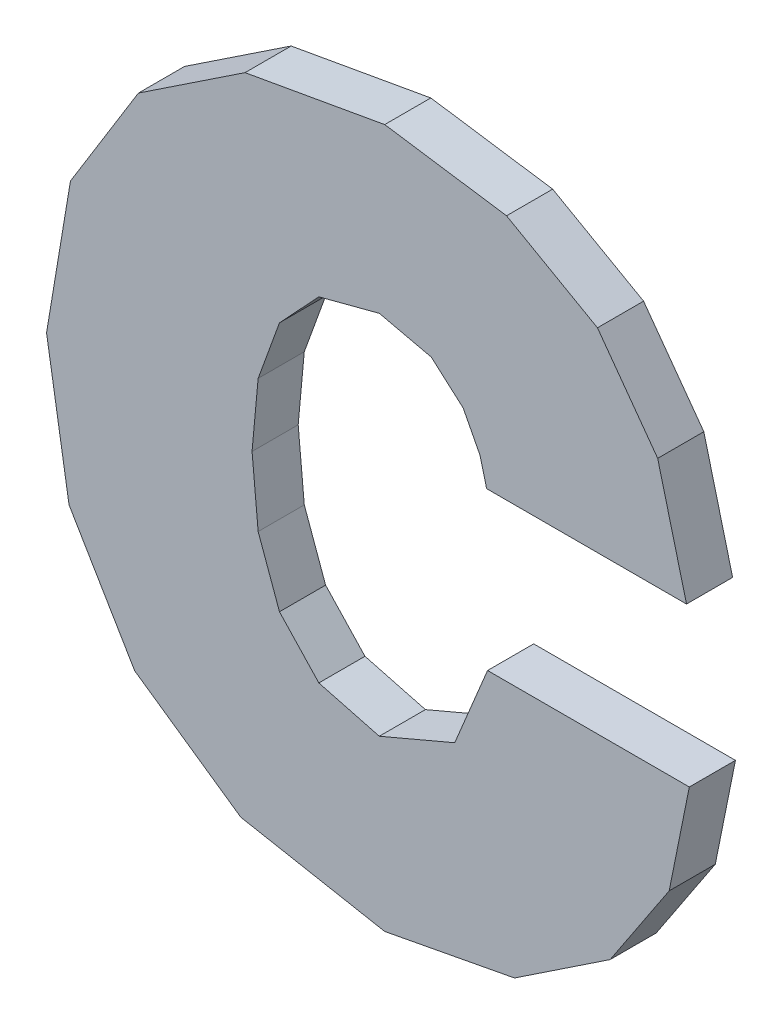
ISO-10303-21;
HEADER;
FILE_DESCRIPTION(('STEP AP214'),'2;1');
FILE_NAME('part.step','',(''),(''),'','','');
FILE_SCHEMA(('AUTOMOTIVE_DESIGN { 1 0 10303 214 1 1 1 1 }'));
ENDSEC;
DATA;
#1=APPLICATION_CONTEXT('core data for automotive mechanical design processes');
#2=APPLICATION_PROTOCOL_DEFINITION('international standard','automotive_design',2000,#1);
#3=PRODUCT_CONTEXT('',#1,'mechanical');
#4=PRODUCT('Part','Part','',(#3));
#5=PRODUCT_RELATED_PRODUCT_CATEGORY('part','',(#4));
#6=PRODUCT_DEFINITION_FORMATION('','',#4);
#7=PRODUCT_DEFINITION_CONTEXT('part definition',#1,'design');
#8=PRODUCT_DEFINITION('design','',#6,#7);
#9=PRODUCT_DEFINITION_SHAPE('','',#8);
#10=(LENGTH_UNIT() NAMED_UNIT(*) SI_UNIT(.MILLI.,.METRE.));
#11=(NAMED_UNIT(*) PLANE_ANGLE_UNIT() SI_UNIT($,.RADIAN.));
#12=(NAMED_UNIT(*) SI_UNIT($,.STERADIAN.) SOLID_ANGLE_UNIT());
#13=UNCERTAINTY_MEASURE_WITH_UNIT(LENGTH_MEASURE(1.E-05),#10,'distance_accuracy_value','');
#14=(GEOMETRIC_REPRESENTATION_CONTEXT(3) GLOBAL_UNCERTAINTY_ASSIGNED_CONTEXT((#13)) GLOBAL_UNIT_ASSIGNED_CONTEXT((#10,
#11,#12)) REPRESENTATION_CONTEXT('',''));
#15=CARTESIAN_POINT('',(0.,0.,0.));
#16=DIRECTION('',(0.,0.,1.));
#17=DIRECTION('',(1.,0.,0.));
#18=AXIS2_PLACEMENT_3D('',#15,#16,#17);
#19=CARTESIAN_POINT('',(0.,0.,0.05));
#20=DIRECTION('',(0.,0.,1.));
#21=DIRECTION('',(1.,0.,0.));
#22=AXIS2_PLACEMENT_3D('',#19,#20,#21);
#23=PLANE('',#22);
#24=DIRECTION('',(-0.869893934693317,0.49323882894981,0.));
#25=VECTOR('',#24,1.);
#26=CARTESIAN_POINT('',(1.340866,1.319276,0.05));
#27=LINE('',#26,#25);
#28=CARTESIAN_POINT('',(1.242314,1.375156,0.05));
#29=VERTEX_POINT('',#28);
#30=CARTESIAN_POINT('',(1.340866,1.319276,0.05));
#31=VERTEX_POINT('',#30);
#32=EDGE_CURVE('E238',#29,#31,#27,.F.);
#33=ORIENTED_EDGE('',*,*,#32,.F.);
#34=DIRECTION('',(-0.989213673825086,0.146479717085598,0.));
#35=VECTOR('',#34,1.);
#36=CARTESIAN_POINT('',(1.242314,1.375156,0.05));
#37=LINE('',#36,#35);
#38=CARTESIAN_POINT('',(1.110234,1.394714,0.05));
#39=VERTEX_POINT('',#38);
#40=EDGE_CURVE('E20',#39,#29,#37,.F.);
#41=ORIENTED_EDGE('',*,*,#40,.F.);
#42=DIRECTION('',(-0.984549852811266,-0.175104504023494,0.));
#43=VECTOR('',#42,1.);
#44=CARTESIAN_POINT('',(1.110234,1.394714,0.05));
#45=LINE('',#44,#43);
#46=CARTESIAN_POINT('',(0.95885,1.36779,0.05));
#47=VERTEX_POINT('',#46);
#48=EDGE_CURVE('E227',#47,#39,#45,.F.);
#49=ORIENTED_EDGE('',*,*,#48,.F.);
#50=DIRECTION('',(-0.832331618057671,-0.554277978618581,0.));
#51=VECTOR('',#50,1.);
#52=CARTESIAN_POINT('',(0.95885,1.36779,0.05));
#53=LINE('',#52,#51);
#54=CARTESIAN_POINT('',(0.843279999999999,1.290828,0.05));
#55=VERTEX_POINT('',#54);
#56=EDGE_CURVE('E222',#55,#47,#53,.F.);
#57=ORIENTED_EDGE('',*,*,#56,.F.);
#58=DIRECTION('',(-0.525107327046591,-0.851036012799685,0.));
#59=VECTOR('',#58,1.);
#60=CARTESIAN_POINT('',(0.84328,1.290828,0.05));
#61=LINE('',#60,#59);
#62=CARTESIAN_POINT('',(0.769620000000001,1.171448,0.05));
#63=VERTEX_POINT('',#62);
#64=EDGE_CURVE('E249',#63,#55,#61,.F.);
#65=ORIENTED_EDGE('',*,*,#64,.F.);
#66=DIRECTION('',(-0.164398987305406,-0.986393923832136,0.));
#67=VECTOR('',#66,1.);
#68=CARTESIAN_POINT('',(0.76962,1.171448,0.05));
#69=LINE('',#68,#67);
#70=CARTESIAN_POINT('',(0.743711999999998,1.016,0.05));
#71=VERTEX_POINT('',#70);
#72=EDGE_CURVE('E253',#71,#63,#69,.F.);
#73=ORIENTED_EDGE('',*,*,#72,.F.);
#74=DIRECTION('',(0.161131898902196,-0.986932880775675,0.));
#75=VECTOR('',#74,1.);
#76=CARTESIAN_POINT('',(0.743712,1.016,0.05));
#77=LINE('',#76,#75);
#78=CARTESIAN_POINT('',(0.768096000000002,0.866648,0.05));
#79=VERTEX_POINT('',#78);
#80=EDGE_CURVE('E257',#79,#71,#77,.F.);
#81=ORIENTED_EDGE('',*,*,#80,.F.);
#82=DIRECTION('',(0.509403382870611,-0.860527857492119,0.));
#83=VECTOR('',#82,1.);
#84=CARTESIAN_POINT('',(0.768096,0.866648,0.05));
#85=LINE('',#84,#83);
#86=CARTESIAN_POINT('',(0.839216,0.746506,0.05));
#87=VERTEX_POINT('',#86);
#88=EDGE_CURVE('E261',#87,#79,#85,.F.);
#89=ORIENTED_EDGE('',*,*,#88,.F.);
#90=DIRECTION('',(0.821016008077818,-0.570905171179912,0.));
#91=VECTOR('',#90,1.);
#92=CARTESIAN_POINT('',(0.839216,0.746506,0.05));
#93=LINE('',#92,#91);
#94=CARTESIAN_POINT('',(0.954278000000001,0.666496000000001,0.05));
#95=VERTEX_POINT('',#94);
#96=EDGE_CURVE('E265',#95,#87,#93,.F.);
#97=ORIENTED_EDGE('',*,*,#96,.F.);
#98=DIRECTION('',(0.982908413087869,-0.184095223949694,0.));
#99=VECTOR('',#98,1.);
#100=CARTESIAN_POINT('',(0.954278,0.666496,0.05));
#101=LINE('',#100,#99);
#102=CARTESIAN_POINT('',(1.110234,0.637286,0.05));
#103=VERTEX_POINT('',#102);
#104=EDGE_CURVE('E269',#103,#95,#101,.F.);
#105=ORIENTED_EDGE('',*,*,#104,.F.);
#106=DIRECTION('',(0.982508908375038,0.186215587327407,0.));
#107=VECTOR('',#106,1.);
#108=CARTESIAN_POINT('',(1.110234,0.637286,0.05));
#109=LINE('',#108,#107);
#110=CARTESIAN_POINT('',(1.25095,0.663956,0.05));
#111=VERTEX_POINT('',#110);
#112=EDGE_CURVE('E273',#111,#103,#109,.F.);
#113=ORIENTED_EDGE('',*,*,#112,.F.);
#114=DIRECTION('',(0.832050294337844,0.554700196225229,0.));
#115=VECTOR('',#114,1.);
#116=CARTESIAN_POINT('',(1.25095,0.663956,0.05));
#117=LINE('',#116,#115);
#118=CARTESIAN_POINT('',(1.354582,0.733044,0.05));
#119=VERTEX_POINT('',#118);
#120=EDGE_CURVE('E277',#119,#111,#117,.F.);
#121=ORIENTED_EDGE('',*,*,#120,.F.);
#122=DIRECTION('',(0.552674107061597,0.833397463029296,0.));
#123=VECTOR('',#122,1.);
#124=CARTESIAN_POINT('',(1.354582,0.733044,0.05));
#125=LINE('',#124,#123);
#126=CARTESIAN_POINT('',(1.41859,0.829563999999999,0.05));
#127=VERTEX_POINT('',#126);
#128=EDGE_CURVE('E281',#127,#119,#125,.F.);
#129=ORIENTED_EDGE('',*,*,#128,.F.);
#130=DIRECTION('',(0.197440467416607,0.980314878917132,0.));
#131=VECTOR('',#130,1.);
#132=CARTESIAN_POINT('',(1.41859,0.829564,0.05));
#133=LINE('',#132,#131);
#134=CARTESIAN_POINT('',(1.440434,0.938022,0.05));
#135=VERTEX_POINT('',#134);
#136=EDGE_CURVE('E285',#135,#127,#133,.F.);
#137=ORIENTED_EDGE('',*,*,#136,.F.);
#138=DIRECTION('',(1.,0.,0.));
#139=VECTOR('',#138,1.);
#140=CARTESIAN_POINT('',(1.440434,0.938022,0.05));
#141=LINE('',#140,#139);
#142=CARTESIAN_POINT('',(1.22174,0.938022,0.05));
#143=VERTEX_POINT('',#142);
#144=EDGE_CURVE('E289',#143,#135,#141,.T.);
#145=ORIENTED_EDGE('',*,*,#144,.F.);
#146=DIRECTION('',(-0.383642282701998,-0.923481780504196,0.));
#147=VECTOR('',#146,1.);
#148=CARTESIAN_POINT('',(1.22174,0.938022,0.05));
#149=LINE('',#148,#147);
#150=CARTESIAN_POINT('',(1.18618,0.852424,0.05));
#151=VERTEX_POINT('',#150);
#152=EDGE_CURVE('E293',#151,#143,#149,.F.);
#153=ORIENTED_EDGE('',*,*,#152,.F.);
#154=DIRECTION('',(-0.920176540598012,-0.391503683422105,0.));
#155=VECTOR('',#154,1.);
#156=CARTESIAN_POINT('',(1.18618,0.852424,0.05));
#157=LINE('',#156,#155);
#158=CARTESIAN_POINT('',(1.104392,0.817626000000001,0.05));
#159=VERTEX_POINT('',#158);
#160=EDGE_CURVE('E297',#159,#151,#157,.F.);
#161=ORIENTED_EDGE('',*,*,#160,.F.);
#162=DIRECTION('',(-0.96697736909533,0.254862252319708,0.));
#163=VECTOR('',#162,1.);
#164=CARTESIAN_POINT('',(1.104392,0.817626,0.05));
#165=LINE('',#164,#163);
#166=CARTESIAN_POINT('',(1.03886,0.834898,0.05));
#167=VERTEX_POINT('',#166);
#168=EDGE_CURVE('E301',#167,#159,#165,.F.);
#169=ORIENTED_EDGE('',*,*,#168,.F.);
#170=DIRECTION('',(-0.6843475255433,0.7291559944777,0.));
#171=VECTOR('',#170,1.);
#172=CARTESIAN_POINT('',(1.03886,0.834898,0.05));
#173=LINE('',#172,#171);
#174=CARTESIAN_POINT('',(0.996188,0.880364,0.05));
#175=VERTEX_POINT('',#174);
#176=EDGE_CURVE('E305',#175,#167,#173,.F.);
#177=ORIENTED_EDGE('',*,*,#176,.F.);
#178=DIRECTION('',(-0.340840704340804,0.940121063621311,0.));
#179=VECTOR('',#178,1.);
#180=CARTESIAN_POINT('',(0.996188,0.880364,0.05));
#181=LINE('',#180,#179);
#182=CARTESIAN_POINT('',(0.973074,0.944118,0.05));
#183=VERTEX_POINT('',#182);
#184=EDGE_CURVE('E309',#183,#175,#181,.F.);
#185=ORIENTED_EDGE('',*,*,#184,.F.);
#186=DIRECTION('',(-0.0914874977038798,0.995806225007598,0.));
#187=VECTOR('',#186,1.);
#188=CARTESIAN_POINT('',(0.973074,0.944118,0.05));
#189=LINE('',#188,#187);
#190=CARTESIAN_POINT('',(0.96647,1.016,0.05));
#191=VERTEX_POINT('',#190);
#192=EDGE_CURVE('E313',#191,#183,#189,.F.);
#193=ORIENTED_EDGE('',*,*,#192,.F.);
#194=DIRECTION('',(0.0914874977038798,0.995806225007598,0.));
#195=VECTOR('',#194,1.);
#196=CARTESIAN_POINT('',(0.96647,1.016,0.05));
#197=LINE('',#196,#195);
#198=CARTESIAN_POINT('',(0.973074,1.087882,0.05));
#199=VERTEX_POINT('',#198);
#200=EDGE_CURVE('E317',#199,#191,#197,.F.);
#201=ORIENTED_EDGE('',*,*,#200,.F.);
#202=DIRECTION('',(0.340840704340804,0.940121063621311,0.));
#203=VECTOR('',#202,1.);
#204=CARTESIAN_POINT('',(0.973074,1.087882,0.05));
#205=LINE('',#204,#203);
#206=CARTESIAN_POINT('',(0.996188,1.151636,0.05));
#207=VERTEX_POINT('',#206);
#208=EDGE_CURVE('E321',#207,#199,#205,.F.);
#209=ORIENTED_EDGE('',*,*,#208,.F.);
#210=DIRECTION('',(0.68231825035999,0.731055268242889,0.));
#211=VECTOR('',#210,1.);
#212=CARTESIAN_POINT('',(0.996188,1.151636,0.05));
#213=LINE('',#212,#211);
#214=CARTESIAN_POINT('',(1.03886,1.197356,0.05));
#215=VERTEX_POINT('',#214);
#216=EDGE_CURVE('E325',#215,#207,#213,.F.);
#217=ORIENTED_EDGE('',*,*,#216,.F.);
#218=DIRECTION('',(0.96697736909533,0.254862252319708,0.));
#219=VECTOR('',#218,1.);
#220=CARTESIAN_POINT('',(1.03886,1.197356,0.05));
#221=LINE('',#220,#219);
#222=CARTESIAN_POINT('',(1.104392,1.214628,0.05));
#223=VERTEX_POINT('',#222);
#224=EDGE_CURVE('E329',#223,#215,#221,.F.);
#225=ORIENTED_EDGE('',*,*,#224,.F.);
#226=DIRECTION('',(0.974612694662197,-0.223897510935899,0.));
#227=VECTOR('',#226,1.);
#228=CARTESIAN_POINT('',(1.104392,1.214628,0.05));
#229=LINE('',#228,#227);
#230=CARTESIAN_POINT('',(1.16078,1.201674,0.05));
#231=VERTEX_POINT('',#230);
#232=EDGE_CURVE('E333',#231,#223,#229,.F.);
#233=ORIENTED_EDGE('',*,*,#232,.F.);
#234=DIRECTION('',(0.749837855365119,-0.661621637086817,0.));
#235=VECTOR('',#234,1.);
#236=CARTESIAN_POINT('',(1.16078,1.201674,0.05));
#237=LINE('',#236,#235);
#238=CARTESIAN_POINT('',(1.195324,1.171194,0.05));
#239=VERTEX_POINT('',#238);
#240=EDGE_CURVE('E337',#239,#231,#237,.F.);
#241=ORIENTED_EDGE('',*,*,#240,.F.);
#242=DIRECTION('',(0.459944196113016,-0.88794782305153,0.));
#243=VECTOR('',#242,1.);
#244=CARTESIAN_POINT('',(1.195324,1.171194,0.05));
#245=LINE('',#244,#243);
#246=CARTESIAN_POINT('',(1.213612,1.135888,0.05));
#247=VERTEX_POINT('',#246);
#248=EDGE_CURVE('E341',#247,#239,#245,.F.);
#249=ORIENTED_EDGE('',*,*,#248,.F.);
#250=DIRECTION('',(0.248802897808998,-0.968554137899294,0.));
#251=VECTOR('',#250,1.);
#252=CARTESIAN_POINT('',(1.213612,1.135888,0.05));
#253=LINE('',#252,#251);
#254=CARTESIAN_POINT('',(1.220724,1.108202,0.05));
#255=VERTEX_POINT('',#254);
#256=EDGE_CURVE('E345',#255,#247,#253,.F.);
#257=ORIENTED_EDGE('',*,*,#256,.F.);
#258=DIRECTION('',(1.,0.,0.));
#259=VECTOR('',#258,1.);
#260=CARTESIAN_POINT('',(1.220724,1.108202,0.05));
#261=LINE('',#260,#259);
#262=CARTESIAN_POINT('',(1.437386,1.108202,0.05));
#263=VERTEX_POINT('',#262);
#264=EDGE_CURVE('E349',#263,#255,#261,.F.);
#265=ORIENTED_EDGE('',*,*,#264,.F.);
#266=DIRECTION('',(-0.2496938263125,0.968324838626699,0.));
#267=VECTOR('',#266,1.);
#268=CARTESIAN_POINT('',(1.437386,1.108202,0.05));
#269=LINE('',#268,#267);
#270=CARTESIAN_POINT('',(1.406144,1.22936,0.05));
#271=VERTEX_POINT('',#270);
#272=EDGE_CURVE('E353',#271,#263,#269,.F.);
#273=ORIENTED_EDGE('',*,*,#272,.F.);
#274=DIRECTION('',(-0.587491880087166,0.809230060509153,0.));
#275=VECTOR('',#274,1.);
#276=CARTESIAN_POINT('',(1.406144,1.22936,0.05));
#277=LINE('',#276,#275);
#278=EDGE_CURVE('E357',#31,#271,#277,.F.);
#279=ORIENTED_EDGE('',*,*,#278,.F.);
#280=EDGE_LOOP('',(#33,#41,#49,#57,#65,#73,#81,#89,#97,#105,#113,#121,#129,#137,#145,#153,#161,
#169,#177,#185,#193,#201,#209,#217,#225,#233,#241,#249,#257,#265,#273,#279));
#281=FACE_BOUND('',#280,.T.);
#282=ADVANCED_FACE('F17',(#281),#23,.T.);
#283=CARTESIAN_POINT('',(1.242314,1.375156,0.));
#284=DIRECTION('',(0.146479717085598,0.989213673825086,0.));
#285=DIRECTION('',(-0.989213673825086,0.146479717085598,0.));
#286=AXIS2_PLACEMENT_3D('',#283,#284,#285);
#287=PLANE('',#286);
#288=DIRECTION('',(0.,0.,1.));
#289=VECTOR('',#288,1.);
#290=CARTESIAN_POINT('',(1.242314,1.375156,0.));
#291=LINE('',#290,#289);
#292=CARTESIAN_POINT('',(1.242314,1.375156,0.));
#293=VERTEX_POINT('',#292);
#294=EDGE_CURVE('E361',#293,#29,#291,.T.);
#295=ORIENTED_EDGE('',*,*,#294,.F.);
#296=DIRECTION('',(-0.98921367382508,0.146479717085637,0.));
#297=VECTOR('',#296,1.);
#298=CARTESIAN_POINT('',(1.242314,1.375156,0.));
#299=LINE('',#298,#297);
#300=CARTESIAN_POINT('',(1.110234,1.394714,0.));
#301=VERTEX_POINT('',#300);
#302=EDGE_CURVE('E244',#293,#301,#299,.T.);
#303=ORIENTED_EDGE('',*,*,#302,.T.);
#304=DIRECTION('',(0.,0.,1.));
#305=VECTOR('',#304,1.);
#306=CARTESIAN_POINT('',(1.110234,1.394714,0.));
#307=LINE('',#306,#305);
#308=EDGE_CURVE('E232',#39,#301,#307,.F.);
#309=ORIENTED_EDGE('',*,*,#308,.F.);
#310=ORIENTED_EDGE('',*,*,#40,.T.);
#311=EDGE_LOOP('',(#295,#303,#309,#310));
#312=FACE_BOUND('',#311,.T.);
#313=ADVANCED_FACE('F243',(#312),#287,.T.);
#314=CARTESIAN_POINT('',(1.110234,1.394714,0.));
#315=DIRECTION('',(-0.175104504023494,0.984549852811266,0.));
#316=DIRECTION('',(-0.984549852811266,-0.175104504023494,0.));
#317=AXIS2_PLACEMENT_3D('',#314,#315,#316);
#318=PLANE('',#317);
#319=ORIENTED_EDGE('',*,*,#308,.T.);
#320=DIRECTION('',(-0.984549852811269,-0.175104504023481,0.));
#321=VECTOR('',#320,1.);
#322=CARTESIAN_POINT('',(1.110234,1.394714,0.));
#323=LINE('',#322,#321);
#324=CARTESIAN_POINT('',(0.95885,1.36779,0.));
#325=VERTEX_POINT('',#324);
#326=EDGE_CURVE('E366',#301,#325,#323,.T.);
#327=ORIENTED_EDGE('',*,*,#326,.T.);
#328=DIRECTION('',(0.,0.,1.));
#329=VECTOR('',#328,1.);
#330=CARTESIAN_POINT('',(0.95885,1.36779,0.));
#331=LINE('',#330,#329);
#332=EDGE_CURVE('E234',#47,#325,#331,.F.);
#333=ORIENTED_EDGE('',*,*,#332,.F.);
#334=ORIENTED_EDGE('',*,*,#48,.T.);
#335=EDGE_LOOP('',(#319,#327,#333,#334));
#336=FACE_BOUND('',#335,.T.);
#337=ADVANCED_FACE('F229',(#336),#318,.T.);
#338=CARTESIAN_POINT('',(0.95885,1.36779,0.));
#339=DIRECTION('',(-0.554277978618581,0.832331618057671,0.));
#340=DIRECTION('',(-0.832331618057671,-0.554277978618581,0.));
#341=AXIS2_PLACEMENT_3D('',#338,#339,#340);
#342=PLANE('',#341);
#343=ORIENTED_EDGE('',*,*,#332,.T.);
#344=DIRECTION('',(-0.832331618057651,-0.554277978618611,0.));
#345=VECTOR('',#344,1.);
#346=CARTESIAN_POINT('',(0.95885,1.36779,0.));
#347=LINE('',#346,#345);
#348=CARTESIAN_POINT('',(0.843279999999999,1.290828,0.));
#349=VERTEX_POINT('',#348);
#350=EDGE_CURVE('E368',#325,#349,#347,.T.);
#351=ORIENTED_EDGE('',*,*,#350,.T.);
#352=DIRECTION('',(0.,0.,1.));
#353=VECTOR('',#352,1.);
#354=CARTESIAN_POINT('',(0.84328,1.290828,0.));
#355=LINE('',#354,#353);
#356=EDGE_CURVE('E251',#55,#349,#355,.F.);
#357=ORIENTED_EDGE('',*,*,#356,.F.);
#358=ORIENTED_EDGE('',*,*,#56,.T.);
#359=EDGE_LOOP('',(#343,#351,#357,#358));
#360=FACE_BOUND('',#359,.T.);
#361=ADVANCED_FACE('F594',(#360),#342,.T.);
#362=CARTESIAN_POINT('',(0.84328,1.290828,0.));
#363=DIRECTION('',(-0.851036012799685,0.525107327046591,0.));
#364=DIRECTION('',(-0.525107327046591,-0.851036012799685,0.));
#365=AXIS2_PLACEMENT_3D('',#362,#363,#364);
#366=PLANE('',#365);
#367=ORIENTED_EDGE('',*,*,#356,.T.);
#368=DIRECTION('',(-0.525107327046608,-0.851036012799674,0.));
#369=VECTOR('',#368,1.);
#370=CARTESIAN_POINT('',(0.84328,1.290828,0.));
#371=LINE('',#370,#369);
#372=CARTESIAN_POINT('',(0.769620000000001,1.171448,0.));
#373=VERTEX_POINT('',#372);
#374=EDGE_CURVE('E371',#349,#373,#371,.T.);
#375=ORIENTED_EDGE('',*,*,#374,.T.);
#376=DIRECTION('',(0.,0.,1.));
#377=VECTOR('',#376,1.);
#378=CARTESIAN_POINT('',(0.76962,1.171448,0.));
#379=LINE('',#378,#377);
#380=EDGE_CURVE('E255',#63,#373,#379,.F.);
#381=ORIENTED_EDGE('',*,*,#380,.F.);
#382=ORIENTED_EDGE('',*,*,#64,.T.);
#383=EDGE_LOOP('',(#367,#375,#381,#382));
#384=FACE_BOUND('',#383,.T.);
#385=ADVANCED_FACE('F593',(#384),#366,.T.);
#386=CARTESIAN_POINT('',(0.76962,1.171448,0.));
#387=DIRECTION('',(-0.986393923832136,0.164398987305406,0.));
#388=DIRECTION('',(-0.164398987305406,-0.986393923832136,0.));
#389=AXIS2_PLACEMENT_3D('',#386,#387,#388);
#390=PLANE('',#389);
#391=ORIENTED_EDGE('',*,*,#380,.T.);
#392=DIRECTION('',(-0.164398987305356,-0.986393923832144,0.));
#393=VECTOR('',#392,1.);
#394=CARTESIAN_POINT('',(0.76962,1.171448,0.));
#395=LINE('',#394,#393);
#396=CARTESIAN_POINT('',(0.743711999999996,1.016,0.));
#397=VERTEX_POINT('',#396);
#398=EDGE_CURVE('E374',#373,#397,#395,.T.);
#399=ORIENTED_EDGE('',*,*,#398,.T.);
#400=DIRECTION('',(0.,0.,1.));
#401=VECTOR('',#400,1.);
#402=CARTESIAN_POINT('',(0.743712,1.016,0.));
#403=LINE('',#402,#401);
#404=EDGE_CURVE('E259',#71,#397,#403,.F.);
#405=ORIENTED_EDGE('',*,*,#404,.F.);
#406=ORIENTED_EDGE('',*,*,#72,.T.);
#407=EDGE_LOOP('',(#391,#399,#405,#406));
#408=FACE_BOUND('',#407,.T.);
#409=ADVANCED_FACE('F587',(#408),#390,.T.);
#410=CARTESIAN_POINT('',(0.743712,1.016,0.));
#411=DIRECTION('',(-0.986932880775675,-0.161131898902196,0.));
#412=DIRECTION('',(0.161131898902196,-0.986932880775675,0.));
#413=AXIS2_PLACEMENT_3D('',#410,#411,#412);
#414=PLANE('',#413);
#415=ORIENTED_EDGE('',*,*,#404,.T.);
#416=DIRECTION('',(0.161131898902152,-0.986932880775682,0.));
#417=VECTOR('',#416,1.);
#418=CARTESIAN_POINT('',(0.743712,1.016,0.));
#419=LINE('',#418,#417);
#420=CARTESIAN_POINT('',(0.768096000000003,0.866648000000001,0.));
#421=VERTEX_POINT('',#420);
#422=EDGE_CURVE('E377',#397,#421,#419,.T.);
#423=ORIENTED_EDGE('',*,*,#422,.T.);
#424=DIRECTION('',(0.,0.,1.));
#425=VECTOR('',#424,1.);
#426=CARTESIAN_POINT('',(0.768096,0.866648,0.));
#427=LINE('',#426,#425);
#428=EDGE_CURVE('E263',#79,#421,#427,.F.);
#429=ORIENTED_EDGE('',*,*,#428,.F.);
#430=ORIENTED_EDGE('',*,*,#80,.T.);
#431=EDGE_LOOP('',(#415,#423,#429,#430));
#432=FACE_BOUND('',#431,.T.);
#433=ADVANCED_FACE('F583',(#432),#414,.T.);
#434=CARTESIAN_POINT('',(0.768096,0.866648,0.));
#435=DIRECTION('',(-0.860527857492119,-0.509403382870611,0.));
#436=DIRECTION('',(0.509403382870611,-0.860527857492119,0.));
#437=AXIS2_PLACEMENT_3D('',#434,#435,#436);
#438=PLANE('',#437);
#439=ORIENTED_EDGE('',*,*,#428,.T.);
#440=DIRECTION('',(0.509403382870602,-0.860527857492125,0.));
#441=VECTOR('',#440,1.);
#442=CARTESIAN_POINT('',(0.768096,0.866648,0.));
#443=LINE('',#442,#441);
#444=CARTESIAN_POINT('',(0.839216000000001,0.746506,0.));
#445=VERTEX_POINT('',#444);
#446=EDGE_CURVE('E380',#421,#445,#443,.T.);
#447=ORIENTED_EDGE('',*,*,#446,.T.);
#448=DIRECTION('',(0.,0.,1.));
#449=VECTOR('',#448,1.);
#450=CARTESIAN_POINT('',(0.839216,0.746506,0.));
#451=LINE('',#450,#449);
#452=EDGE_CURVE('E267',#87,#445,#451,.F.);
#453=ORIENTED_EDGE('',*,*,#452,.F.);
#454=ORIENTED_EDGE('',*,*,#88,.T.);
#455=EDGE_LOOP('',(#439,#447,#453,#454));
#456=FACE_BOUND('',#455,.T.);
#457=ADVANCED_FACE('F577',(#456),#438,.T.);
#458=CARTESIAN_POINT('',(0.839216,0.746506,0.));
#459=DIRECTION('',(-0.570905171179912,-0.821016008077818,0.));
#460=DIRECTION('',(0.821016008077818,-0.570905171179912,0.));
#461=AXIS2_PLACEMENT_3D('',#458,#459,#460);
#462=PLANE('',#461);
#463=ORIENTED_EDGE('',*,*,#452,.T.);
#464=DIRECTION('',(0.821016008077805,-0.57090517117993,0.));
#465=VECTOR('',#464,1.);
#466=CARTESIAN_POINT('',(0.839216,0.746506,0.));
#467=LINE('',#466,#465);
#468=CARTESIAN_POINT('',(0.954278000000001,0.666496000000001,0.));
#469=VERTEX_POINT('',#468);
#470=EDGE_CURVE('E383',#445,#469,#467,.T.);
#471=ORIENTED_EDGE('',*,*,#470,.T.);
#472=DIRECTION('',(0.,0.,1.));
#473=VECTOR('',#472,1.);
#474=CARTESIAN_POINT('',(0.954278,0.666496,0.));
#475=LINE('',#474,#473);
#476=EDGE_CURVE('E271',#95,#469,#475,.F.);
#477=ORIENTED_EDGE('',*,*,#476,.F.);
#478=ORIENTED_EDGE('',*,*,#96,.T.);
#479=EDGE_LOOP('',(#463,#471,#477,#478));
#480=FACE_BOUND('',#479,.T.);
#481=ADVANCED_FACE('F573',(#480),#462,.T.);
#482=CARTESIAN_POINT('',(0.954278,0.666496,0.));
#483=DIRECTION('',(-0.184095223949694,-0.982908413087869,0.));
#484=DIRECTION('',(0.982908413087869,-0.184095223949694,0.));
#485=AXIS2_PLACEMENT_3D('',#482,#483,#484);
#486=PLANE('',#485);
#487=ORIENTED_EDGE('',*,*,#476,.T.);
#488=DIRECTION('',(0.982908413087871,-0.184095223949683,0.));
#489=VECTOR('',#488,1.);
#490=CARTESIAN_POINT('',(0.954278,0.666496,0.));
#491=LINE('',#490,#489);
#492=CARTESIAN_POINT('',(1.110234,0.637285999999999,0.));
#493=VERTEX_POINT('',#492);
#494=EDGE_CURVE('E386',#469,#493,#491,.T.);
#495=ORIENTED_EDGE('',*,*,#494,.T.);
#496=DIRECTION('',(0.,0.,1.));
#497=VECTOR('',#496,1.);
#498=CARTESIAN_POINT('',(1.110234,0.637286,0.));
#499=LINE('',#498,#497);
#500=EDGE_CURVE('E275',#103,#493,#499,.F.);
#501=ORIENTED_EDGE('',*,*,#500,.F.);
#502=ORIENTED_EDGE('',*,*,#104,.T.);
#503=EDGE_LOOP('',(#487,#495,#501,#502));
#504=FACE_BOUND('',#503,.T.);
#505=ADVANCED_FACE('F567',(#504),#486,.T.);
#506=CARTESIAN_POINT('',(1.110234,0.637286,0.));
#507=DIRECTION('',(0.186215587327407,-0.982508908375038,0.));
#508=DIRECTION('',(0.982508908375038,0.186215587327407,0.));
#509=AXIS2_PLACEMENT_3D('',#506,#507,#508);
#510=PLANE('',#509);
#511=ORIENTED_EDGE('',*,*,#500,.T.);
#512=DIRECTION('',(0.98250890837504,0.186215587327399,0.));
#513=VECTOR('',#512,1.);
#514=CARTESIAN_POINT('',(1.110234,0.637286,0.));
#515=LINE('',#514,#513);
#516=CARTESIAN_POINT('',(1.25095,0.663956000000001,0.));
#517=VERTEX_POINT('',#516);
#518=EDGE_CURVE('E389',#493,#517,#515,.T.);
#519=ORIENTED_EDGE('',*,*,#518,.T.);
#520=DIRECTION('',(0.,0.,1.));
#521=VECTOR('',#520,1.);
#522=CARTESIAN_POINT('',(1.25095,0.663956,0.));
#523=LINE('',#522,#521);
#524=EDGE_CURVE('E279',#111,#517,#523,.F.);
#525=ORIENTED_EDGE('',*,*,#524,.F.);
#526=ORIENTED_EDGE('',*,*,#112,.T.);
#527=EDGE_LOOP('',(#511,#519,#525,#526));
#528=FACE_BOUND('',#527,.T.);
#529=ADVANCED_FACE('F563',(#528),#510,.T.);
#530=CARTESIAN_POINT('',(1.25095,0.663956,0.));
#531=DIRECTION('',(0.554700196225229,-0.832050294337844,0.));
#532=DIRECTION('',(0.832050294337844,0.554700196225229,0.));
#533=AXIS2_PLACEMENT_3D('',#530,#531,#532);
#534=PLANE('',#533);
#535=ORIENTED_EDGE('',*,*,#524,.T.);
#536=DIRECTION('',(0.832050294337843,0.554700196225229,0.));
#537=VECTOR('',#536,1.);
#538=CARTESIAN_POINT('',(1.25095,0.663956,0.));
#539=LINE('',#538,#537);
#540=CARTESIAN_POINT('',(1.354582,0.733044,0.));
#541=VERTEX_POINT('',#540);
#542=EDGE_CURVE('E392',#517,#541,#539,.T.);
#543=ORIENTED_EDGE('',*,*,#542,.T.);
#544=DIRECTION('',(0.,0.,1.));
#545=VECTOR('',#544,1.);
#546=CARTESIAN_POINT('',(1.354582,0.733044,0.));
#547=LINE('',#546,#545);
#548=EDGE_CURVE('E283',#119,#541,#547,.F.);
#549=ORIENTED_EDGE('',*,*,#548,.F.);
#550=ORIENTED_EDGE('',*,*,#120,.T.);
#551=EDGE_LOOP('',(#535,#543,#549,#550));
#552=FACE_BOUND('',#551,.T.);
#553=ADVANCED_FACE('F557',(#552),#534,.T.);
#554=CARTESIAN_POINT('',(1.354582,0.733044,0.));
#555=DIRECTION('',(0.833397463029296,-0.552674107061597,0.));
#556=DIRECTION('',(0.552674107061597,0.833397463029296,0.));
#557=AXIS2_PLACEMENT_3D('',#554,#555,#556);
#558=PLANE('',#557);
#559=ORIENTED_EDGE('',*,*,#548,.T.);
#560=DIRECTION('',(0.552674107061553,0.833397463029325,0.));
#561=VECTOR('',#560,1.);
#562=CARTESIAN_POINT('',(1.354582,0.733044,0.));
#563=LINE('',#562,#561);
#564=CARTESIAN_POINT('',(1.41859,0.829563999999998,0.));
#565=VERTEX_POINT('',#564);
#566=EDGE_CURVE('E395',#541,#565,#563,.T.);
#567=ORIENTED_EDGE('',*,*,#566,.T.);
#568=DIRECTION('',(0.,0.,1.));
#569=VECTOR('',#568,1.);
#570=CARTESIAN_POINT('',(1.41859,0.829564,0.));
#571=LINE('',#570,#569);
#572=EDGE_CURVE('E287',#127,#565,#571,.F.);
#573=ORIENTED_EDGE('',*,*,#572,.F.);
#574=ORIENTED_EDGE('',*,*,#128,.T.);
#575=EDGE_LOOP('',(#559,#567,#573,#574));
#576=FACE_BOUND('',#575,.T.);
#577=ADVANCED_FACE('F553',(#576),#558,.T.);
#578=CARTESIAN_POINT('',(1.41859,0.829564,0.));
#579=DIRECTION('',(0.980314878917132,-0.197440467416607,0.));
#580=DIRECTION('',(0.197440467416607,0.980314878917132,0.));
#581=AXIS2_PLACEMENT_3D('',#578,#579,#580);
#582=PLANE('',#581);
#583=ORIENTED_EDGE('',*,*,#572,.T.);
#584=DIRECTION('',(0.197440467416567,0.98031487891714,0.));
#585=VECTOR('',#584,1.);
#586=CARTESIAN_POINT('',(1.41859,0.829564,0.));
#587=LINE('',#586,#585);
#588=CARTESIAN_POINT('',(1.440434,0.938022,0.));
#589=VERTEX_POINT('',#588);
#590=EDGE_CURVE('E398',#565,#589,#587,.T.);
#591=ORIENTED_EDGE('',*,*,#590,.T.);
#592=DIRECTION('',(0.,0.,1.));
#593=VECTOR('',#592,1.);
#594=CARTESIAN_POINT('',(1.440434,0.938022,0.));
#595=LINE('',#594,#593);
#596=EDGE_CURVE('E291',#135,#589,#595,.F.);
#597=ORIENTED_EDGE('',*,*,#596,.F.);
#598=ORIENTED_EDGE('',*,*,#136,.T.);
#599=EDGE_LOOP('',(#583,#591,#597,#598));
#600=FACE_BOUND('',#599,.T.);
#601=ADVANCED_FACE('F547',(#600),#582,.T.);
#602=CARTESIAN_POINT('',(1.440434,0.938022,0.));
#603=DIRECTION('',(0.,1.,0.));
#604=DIRECTION('',(0.,0.,1.));
#605=AXIS2_PLACEMENT_3D('',#602,#603,#604);
#606=PLANE('',#605);
#607=ORIENTED_EDGE('',*,*,#596,.T.);
#608=DIRECTION('',(1.,0.,0.));
#609=VECTOR('',#608,1.);
#610=CARTESIAN_POINT('',(0.,0.938022,0.));
#611=LINE('',#610,#609);
#612=CARTESIAN_POINT('',(1.22174,0.938022,0.));
#613=VERTEX_POINT('',#612);
#614=EDGE_CURVE('E401',#589,#613,#611,.F.);
#615=ORIENTED_EDGE('',*,*,#614,.T.);
#616=DIRECTION('',(0.,0.,1.));
#617=VECTOR('',#616,1.);
#618=CARTESIAN_POINT('',(1.22174,0.938022,0.));
#619=LINE('',#618,#617);
#620=EDGE_CURVE('E295',#143,#613,#619,.F.);
#621=ORIENTED_EDGE('',*,*,#620,.F.);
#622=ORIENTED_EDGE('',*,*,#144,.T.);
#623=EDGE_LOOP('',(#607,#615,#621,#622));
#624=FACE_BOUND('',#623,.T.);
#625=ADVANCED_FACE('F543',(#624),#606,.T.);
#626=CARTESIAN_POINT('',(1.22174,0.938022,0.));
#627=DIRECTION('',(-0.923481780504196,0.383642282701998,0.));
#628=DIRECTION('',(-0.383642282701998,-0.923481780504196,0.));
#629=AXIS2_PLACEMENT_3D('',#626,#627,#628);
#630=PLANE('',#629);
#631=ORIENTED_EDGE('',*,*,#620,.T.);
#632=DIRECTION('',(-0.383642282702034,-0.923481780504181,0.));
#633=VECTOR('',#632,1.);
#634=CARTESIAN_POINT('',(1.22174,0.938022,0.));
#635=LINE('',#634,#633);
#636=CARTESIAN_POINT('',(1.18618,0.852423999999999,0.));
#637=VERTEX_POINT('',#636);
#638=EDGE_CURVE('E404',#613,#637,#635,.T.);
#639=ORIENTED_EDGE('',*,*,#638,.T.);
#640=DIRECTION('',(0.,0.,1.));
#641=VECTOR('',#640,1.);
#642=CARTESIAN_POINT('',(1.18618,0.852424,0.));
#643=LINE('',#642,#641);
#644=EDGE_CURVE('E299',#151,#637,#643,.F.);
#645=ORIENTED_EDGE('',*,*,#644,.F.);
#646=ORIENTED_EDGE('',*,*,#152,.T.);
#647=EDGE_LOOP('',(#631,#639,#645,#646));
#648=FACE_BOUND('',#647,.T.);
#649=ADVANCED_FACE('F537',(#648),#630,.T.);
#650=CARTESIAN_POINT('',(1.18618,0.852424,0.));
#651=DIRECTION('',(-0.391503683422105,0.920176540598012,0.));
#652=DIRECTION('',(-0.920176540598012,-0.391503683422105,0.));
#653=AXIS2_PLACEMENT_3D('',#650,#651,#652);
#654=PLANE('',#653);
#655=ORIENTED_EDGE('',*,*,#644,.T.);
#656=DIRECTION('',(-0.920176540598001,-0.39150368342213,0.));
#657=VECTOR('',#656,1.);
#658=CARTESIAN_POINT('',(1.18618,0.852424,0.));
#659=LINE('',#658,#657);
#660=CARTESIAN_POINT('',(1.104392,0.817626000000001,0.));
#661=VERTEX_POINT('',#660);
#662=EDGE_CURVE('E407',#637,#661,#659,.T.);
#663=ORIENTED_EDGE('',*,*,#662,.T.);
#664=DIRECTION('',(0.,0.,1.));
#665=VECTOR('',#664,1.);
#666=CARTESIAN_POINT('',(1.104392,0.817626,0.));
#667=LINE('',#666,#665);
#668=EDGE_CURVE('E303',#159,#661,#667,.F.);
#669=ORIENTED_EDGE('',*,*,#668,.F.);
#670=ORIENTED_EDGE('',*,*,#160,.T.);
#671=EDGE_LOOP('',(#655,#663,#669,#670));
#672=FACE_BOUND('',#671,.T.);
#673=ADVANCED_FACE('F533',(#672),#654,.T.);
#674=CARTESIAN_POINT('',(1.104392,0.817626,0.));
#675=DIRECTION('',(0.254862252319708,0.96697736909533,0.));
#676=DIRECTION('',(-0.96697736909533,0.254862252319708,0.));
#677=AXIS2_PLACEMENT_3D('',#674,#675,#676);
#678=PLANE('',#677);
#679=ORIENTED_EDGE('',*,*,#668,.T.);
#680=DIRECTION('',(-0.966977369095332,0.2548622523197,0.));
#681=VECTOR('',#680,1.);
#682=CARTESIAN_POINT('',(1.104392,0.817626,0.));
#683=LINE('',#682,#681);
#684=CARTESIAN_POINT('',(1.03886,0.834898,0.));
#685=VERTEX_POINT('',#684);
#686=EDGE_CURVE('E410',#661,#685,#683,.T.);
#687=ORIENTED_EDGE('',*,*,#686,.T.);
#688=DIRECTION('',(0.,0.,1.));
#689=VECTOR('',#688,1.);
#690=CARTESIAN_POINT('',(1.03886,0.834898,0.));
#691=LINE('',#690,#689);
#692=EDGE_CURVE('E307',#167,#685,#691,.F.);
#693=ORIENTED_EDGE('',*,*,#692,.F.);
#694=ORIENTED_EDGE('',*,*,#168,.T.);
#695=EDGE_LOOP('',(#679,#687,#693,#694));
#696=FACE_BOUND('',#695,.T.);
#697=ADVANCED_FACE('F527',(#696),#678,.T.);
#698=CARTESIAN_POINT('',(1.03886,0.834898,0.));
#699=DIRECTION('',(0.7291559944777,0.6843475255433,0.));
#700=DIRECTION('',(-0.6843475255433,0.7291559944777,0.));
#701=AXIS2_PLACEMENT_3D('',#698,#699,#700);
#702=PLANE('',#701);
#703=ORIENTED_EDGE('',*,*,#692,.T.);
#704=DIRECTION('',(-0.684347525543308,0.729155994477692,0.));
#705=VECTOR('',#704,1.);
#706=CARTESIAN_POINT('',(1.03886,0.834898,0.));
#707=LINE('',#706,#705);
#708=CARTESIAN_POINT('',(0.996188,0.880364,0.));
#709=VERTEX_POINT('',#708);
#710=EDGE_CURVE('E413',#685,#709,#707,.T.);
#711=ORIENTED_EDGE('',*,*,#710,.T.);
#712=DIRECTION('',(0.,0.,1.));
#713=VECTOR('',#712,1.);
#714=CARTESIAN_POINT('',(0.996188,0.880364,0.));
#715=LINE('',#714,#713);
#716=EDGE_CURVE('E311',#175,#709,#715,.F.);
#717=ORIENTED_EDGE('',*,*,#716,.F.);
#718=ORIENTED_EDGE('',*,*,#176,.T.);
#719=EDGE_LOOP('',(#703,#711,#717,#718));
#720=FACE_BOUND('',#719,.T.);
#721=ADVANCED_FACE('F523',(#720),#702,.T.);
#722=CARTESIAN_POINT('',(0.996188,0.880364,0.));
#723=DIRECTION('',(0.940121063621311,0.340840704340804,0.));
#724=DIRECTION('',(-0.340840704340804,0.940121063621311,0.));
#725=AXIS2_PLACEMENT_3D('',#722,#723,#724);
#726=PLANE('',#725);
#727=ORIENTED_EDGE('',*,*,#716,.T.);
#728=DIRECTION('',(-0.340840704340796,0.940121063621314,0.));
#729=VECTOR('',#728,1.);
#730=CARTESIAN_POINT('',(0.996188,0.880364,0.));
#731=LINE('',#730,#729);
#732=CARTESIAN_POINT('',(0.973074,0.944118,0.));
#733=VERTEX_POINT('',#732);
#734=EDGE_CURVE('E416',#709,#733,#731,.T.);
#735=ORIENTED_EDGE('',*,*,#734,.T.);
#736=DIRECTION('',(0.,0.,1.));
#737=VECTOR('',#736,1.);
#738=CARTESIAN_POINT('',(0.973074,0.944118,0.));
#739=LINE('',#738,#737);
#740=EDGE_CURVE('E315',#183,#733,#739,.F.);
#741=ORIENTED_EDGE('',*,*,#740,.F.);
#742=ORIENTED_EDGE('',*,*,#184,.T.);
#743=EDGE_LOOP('',(#727,#735,#741,#742));
#744=FACE_BOUND('',#743,.T.);
#745=ADVANCED_FACE('F517',(#744),#726,.T.);
#746=CARTESIAN_POINT('',(0.973074,0.944118,0.));
#747=DIRECTION('',(0.995806225007598,0.0914874977038798,0.));
#748=DIRECTION('',(-0.0914874977038798,0.995806225007598,0.));
#749=AXIS2_PLACEMENT_3D('',#746,#747,#748);
#750=PLANE('',#749);
#751=ORIENTED_EDGE('',*,*,#740,.T.);
#752=DIRECTION('',(-0.091487497703877,0.995806225007598,0.));
#753=VECTOR('',#752,1.);
#754=CARTESIAN_POINT('',(0.973074,0.944118,0.));
#755=LINE('',#754,#753);
#756=CARTESIAN_POINT('',(0.96647,1.016,0.));
#757=VERTEX_POINT('',#756);
#758=EDGE_CURVE('E419',#733,#757,#755,.T.);
#759=ORIENTED_EDGE('',*,*,#758,.T.);
#760=DIRECTION('',(0.,0.,1.));
#761=VECTOR('',#760,1.);
#762=CARTESIAN_POINT('',(0.96647,1.016,0.));
#763=LINE('',#762,#761);
#764=EDGE_CURVE('E319',#191,#757,#763,.F.);
#765=ORIENTED_EDGE('',*,*,#764,.F.);
#766=ORIENTED_EDGE('',*,*,#192,.T.);
#767=EDGE_LOOP('',(#751,#759,#765,#766));
#768=FACE_BOUND('',#767,.T.);
#769=ADVANCED_FACE('F513',(#768),#750,.T.);
#770=CARTESIAN_POINT('',(0.96647,1.016,0.));
#771=DIRECTION('',(0.995806225007598,-0.0914874977038798,0.));
#772=DIRECTION('',(0.0914874977038798,0.995806225007598,0.));
#773=AXIS2_PLACEMENT_3D('',#770,#771,#772);
#774=PLANE('',#773);
#775=ORIENTED_EDGE('',*,*,#764,.T.);
#776=DIRECTION('',(0.0914874977038767,0.995806225007598,0.));
#777=VECTOR('',#776,1.);
#778=CARTESIAN_POINT('',(0.96647,1.016,0.));
#779=LINE('',#778,#777);
#780=CARTESIAN_POINT('',(0.973074,1.087882,0.));
#781=VERTEX_POINT('',#780);
#782=EDGE_CURVE('E422',#757,#781,#779,.T.);
#783=ORIENTED_EDGE('',*,*,#782,.T.);
#784=DIRECTION('',(0.,0.,1.));
#785=VECTOR('',#784,1.);
#786=CARTESIAN_POINT('',(0.973074,1.087882,0.));
#787=LINE('',#786,#785);
#788=EDGE_CURVE('E323',#199,#781,#787,.F.);
#789=ORIENTED_EDGE('',*,*,#788,.F.);
#790=ORIENTED_EDGE('',*,*,#200,.T.);
#791=EDGE_LOOP('',(#775,#783,#789,#790));
#792=FACE_BOUND('',#791,.T.);
#793=ADVANCED_FACE('F507',(#792),#774,.T.);
#794=CARTESIAN_POINT('',(0.973074,1.087882,0.));
#795=DIRECTION('',(0.940121063621311,-0.340840704340804,0.));
#796=DIRECTION('',(0.340840704340804,0.940121063621311,0.));
#797=AXIS2_PLACEMENT_3D('',#794,#795,#796);
#798=PLANE('',#797);
#799=ORIENTED_EDGE('',*,*,#788,.T.);
#800=DIRECTION('',(0.340840704340796,0.940121063621314,0.));
#801=VECTOR('',#800,1.);
#802=CARTESIAN_POINT('',(0.973074,1.087882,0.));
#803=LINE('',#802,#801);
#804=CARTESIAN_POINT('',(0.996188,1.151636,0.));
#805=VERTEX_POINT('',#804);
#806=EDGE_CURVE('E425',#781,#805,#803,.T.);
#807=ORIENTED_EDGE('',*,*,#806,.T.);
#808=DIRECTION('',(0.,0.,1.));
#809=VECTOR('',#808,1.);
#810=CARTESIAN_POINT('',(0.996188,1.151636,0.));
#811=LINE('',#810,#809);
#812=EDGE_CURVE('E327',#207,#805,#811,.F.);
#813=ORIENTED_EDGE('',*,*,#812,.F.);
#814=ORIENTED_EDGE('',*,*,#208,.T.);
#815=EDGE_LOOP('',(#799,#807,#813,#814));
#816=FACE_BOUND('',#815,.T.);
#817=ADVANCED_FACE('F503',(#816),#798,.T.);
#818=CARTESIAN_POINT('',(0.996188,1.151636,0.));
#819=DIRECTION('',(0.731055268242889,-0.68231825035999,0.));
#820=DIRECTION('',(0.68231825035999,0.731055268242889,0.));
#821=AXIS2_PLACEMENT_3D('',#818,#819,#820);
#822=PLANE('',#821);
#823=ORIENTED_EDGE('',*,*,#812,.T.);
#824=DIRECTION('',(0.68231825036001,0.73105526824287,0.));
#825=VECTOR('',#824,1.);
#826=CARTESIAN_POINT('',(0.996188,1.151636,0.));
#827=LINE('',#826,#825);
#828=CARTESIAN_POINT('',(1.03886,1.197356,0.));
#829=VERTEX_POINT('',#828);
#830=EDGE_CURVE('E428',#805,#829,#827,.T.);
#831=ORIENTED_EDGE('',*,*,#830,.T.);
#832=DIRECTION('',(0.,0.,1.));
#833=VECTOR('',#832,1.);
#834=CARTESIAN_POINT('',(1.03886,1.197356,0.));
#835=LINE('',#834,#833);
#836=EDGE_CURVE('E331',#215,#829,#835,.F.);
#837=ORIENTED_EDGE('',*,*,#836,.F.);
#838=ORIENTED_EDGE('',*,*,#216,.T.);
#839=EDGE_LOOP('',(#823,#831,#837,#838));
#840=FACE_BOUND('',#839,.T.);
#841=ADVANCED_FACE('F497',(#840),#822,.T.);
#842=CARTESIAN_POINT('',(1.03886,1.197356,0.));
#843=DIRECTION('',(0.254862252319708,-0.96697736909533,0.));
#844=DIRECTION('',(0.96697736909533,0.254862252319708,0.));
#845=AXIS2_PLACEMENT_3D('',#842,#843,#844);
#846=PLANE('',#845);
#847=ORIENTED_EDGE('',*,*,#836,.T.);
#848=DIRECTION('',(0.966977369095332,0.2548622523197,0.));
#849=VECTOR('',#848,1.);
#850=CARTESIAN_POINT('',(1.03886,1.197356,0.));
#851=LINE('',#850,#849);
#852=CARTESIAN_POINT('',(1.104392,1.214628,0.));
#853=VERTEX_POINT('',#852);
#854=EDGE_CURVE('E431',#829,#853,#851,.T.);
#855=ORIENTED_EDGE('',*,*,#854,.T.);
#856=DIRECTION('',(0.,0.,1.));
#857=VECTOR('',#856,1.);
#858=CARTESIAN_POINT('',(1.104392,1.214628,0.));
#859=LINE('',#858,#857);
#860=EDGE_CURVE('E335',#223,#853,#859,.F.);
#861=ORIENTED_EDGE('',*,*,#860,.F.);
#862=ORIENTED_EDGE('',*,*,#224,.T.);
#863=EDGE_LOOP('',(#847,#855,#861,#862));
#864=FACE_BOUND('',#863,.T.);
#865=ADVANCED_FACE('F493',(#864),#846,.T.);
#866=CARTESIAN_POINT('',(1.104392,1.214628,0.));
#867=DIRECTION('',(-0.223897510935899,-0.974612694662197,0.));
#868=DIRECTION('',(0.974612694662197,-0.223897510935899,0.));
#869=AXIS2_PLACEMENT_3D('',#866,#867,#868);
#870=PLANE('',#869);
#871=ORIENTED_EDGE('',*,*,#860,.T.);
#872=DIRECTION('',(0.974612694662194,-0.223897510935912,0.));
#873=VECTOR('',#872,1.);
#874=CARTESIAN_POINT('',(1.104392,1.214628,0.));
#875=LINE('',#874,#873);
#876=CARTESIAN_POINT('',(1.16078,1.201674,0.));
#877=VERTEX_POINT('',#876);
#878=EDGE_CURVE('E434',#853,#877,#875,.T.);
#879=ORIENTED_EDGE('',*,*,#878,.T.);
#880=DIRECTION('',(0.,0.,1.));
#881=VECTOR('',#880,1.);
#882=CARTESIAN_POINT('',(1.16078,1.201674,0.));
#883=LINE('',#882,#881);
#884=EDGE_CURVE('E339',#231,#877,#883,.F.);
#885=ORIENTED_EDGE('',*,*,#884,.F.);
#886=ORIENTED_EDGE('',*,*,#232,.T.);
#887=EDGE_LOOP('',(#871,#879,#885,#886));
#888=FACE_BOUND('',#887,.T.);
#889=ADVANCED_FACE('F487',(#888),#870,.T.);
#890=CARTESIAN_POINT('',(1.16078,1.201674,0.));
#891=DIRECTION('',(-0.661621637086817,-0.749837855365119,0.));
#892=DIRECTION('',(0.749837855365119,-0.661621637086817,0.));
#893=AXIS2_PLACEMENT_3D('',#890,#891,#892);
#894=PLANE('',#893);
#895=ORIENTED_EDGE('',*,*,#884,.T.);
#896=DIRECTION('',(0.749837855365095,-0.661621637086844,0.));
#897=VECTOR('',#896,1.);
#898=CARTESIAN_POINT('',(1.16078,1.201674,0.));
#899=LINE('',#898,#897);
#900=CARTESIAN_POINT('',(1.195324,1.171194,0.));
#901=VERTEX_POINT('',#900);
#902=EDGE_CURVE('E437',#877,#901,#899,.T.);
#903=ORIENTED_EDGE('',*,*,#902,.T.);
#904=DIRECTION('',(0.,0.,1.));
#905=VECTOR('',#904,1.);
#906=CARTESIAN_POINT('',(1.195324,1.171194,0.));
#907=LINE('',#906,#905);
#908=EDGE_CURVE('E343',#239,#901,#907,.F.);
#909=ORIENTED_EDGE('',*,*,#908,.F.);
#910=ORIENTED_EDGE('',*,*,#240,.T.);
#911=EDGE_LOOP('',(#895,#903,#909,#910));
#912=FACE_BOUND('',#911,.T.);
#913=ADVANCED_FACE('F483',(#912),#894,.T.);
#914=CARTESIAN_POINT('',(1.195324,1.171194,0.));
#915=DIRECTION('',(-0.88794782305153,-0.459944196113016,0.));
#916=DIRECTION('',(0.459944196113016,-0.88794782305153,0.));
#917=AXIS2_PLACEMENT_3D('',#914,#915,#916);
#918=PLANE('',#917);
#919=ORIENTED_EDGE('',*,*,#908,.T.);
#920=DIRECTION('',(0.45994419611302,-0.887947823051528,0.));
#921=VECTOR('',#920,1.);
#922=CARTESIAN_POINT('',(1.195324,1.171194,0.));
#923=LINE('',#922,#921);
#924=CARTESIAN_POINT('',(1.213612,1.135888,0.));
#925=VERTEX_POINT('',#924);
#926=EDGE_CURVE('E440',#901,#925,#923,.T.);
#927=ORIENTED_EDGE('',*,*,#926,.T.);
#928=DIRECTION('',(0.,0.,1.));
#929=VECTOR('',#928,1.);
#930=CARTESIAN_POINT('',(1.213612,1.135888,0.));
#931=LINE('',#930,#929);
#932=EDGE_CURVE('E347',#247,#925,#931,.F.);
#933=ORIENTED_EDGE('',*,*,#932,.F.);
#934=ORIENTED_EDGE('',*,*,#248,.T.);
#935=EDGE_LOOP('',(#919,#927,#933,#934));
#936=FACE_BOUND('',#935,.T.);
#937=ADVANCED_FACE('F477',(#936),#918,.T.);
#938=CARTESIAN_POINT('',(1.213612,1.135888,0.));
#939=DIRECTION('',(-0.968554137899294,-0.248802897808998,0.));
#940=DIRECTION('',(0.248802897808998,-0.968554137899294,0.));
#941=AXIS2_PLACEMENT_3D('',#938,#939,#940);
#942=PLANE('',#941);
#943=ORIENTED_EDGE('',*,*,#932,.T.);
#944=DIRECTION('',(0.248802897808989,-0.968554137899297,0.));
#945=VECTOR('',#944,1.);
#946=CARTESIAN_POINT('',(1.213612,1.135888,0.));
#947=LINE('',#946,#945);
#948=CARTESIAN_POINT('',(1.220724,1.108202,0.));
#949=VERTEX_POINT('',#948);
#950=EDGE_CURVE('E443',#925,#949,#947,.T.);
#951=ORIENTED_EDGE('',*,*,#950,.T.);
#952=DIRECTION('',(0.,0.,-1.));
#953=VECTOR('',#952,1.);
#954=CARTESIAN_POINT('',(1.220724,1.108202,0.));
#955=LINE('',#954,#953);
#956=EDGE_CURVE('E351',#255,#949,#955,.T.);
#957=ORIENTED_EDGE('',*,*,#956,.F.);
#958=ORIENTED_EDGE('',*,*,#256,.T.);
#959=EDGE_LOOP('',(#943,#951,#957,#958));
#960=FACE_BOUND('',#959,.T.);
#961=ADVANCED_FACE('F473',(#960),#942,.T.);
#962=CARTESIAN_POINT('',(1.220724,1.108202,0.));
#963=DIRECTION('',(0.,-1.,0.));
#964=DIRECTION('',(0.,0.,-1.));
#965=AXIS2_PLACEMENT_3D('',#962,#963,#964);
#966=PLANE('',#965);
#967=ORIENTED_EDGE('',*,*,#956,.T.);
#968=DIRECTION('',(1.,0.,0.));
#969=VECTOR('',#968,1.);
#970=CARTESIAN_POINT('',(0.,1.108202,0.));
#971=LINE('',#970,#969);
#972=CARTESIAN_POINT('',(1.437386,1.108202,0.));
#973=VERTEX_POINT('',#972);
#974=EDGE_CURVE('E446',#949,#973,#971,.T.);
#975=ORIENTED_EDGE('',*,*,#974,.T.);
#976=DIRECTION('',(0.,0.,1.));
#977=VECTOR('',#976,1.);
#978=CARTESIAN_POINT('',(1.437386,1.108202,0.));
#979=LINE('',#978,#977);
#980=EDGE_CURVE('E355',#263,#973,#979,.F.);
#981=ORIENTED_EDGE('',*,*,#980,.F.);
#982=ORIENTED_EDGE('',*,*,#264,.T.);
#983=EDGE_LOOP('',(#967,#975,#981,#982));
#984=FACE_BOUND('',#983,.T.);
#985=ADVANCED_FACE('F467',(#984),#966,.T.);
#986=CARTESIAN_POINT('',(1.437386,1.108202,0.));
#987=DIRECTION('',(0.968324838626699,0.2496938263125,0.));
#988=DIRECTION('',(-0.2496938263125,0.968324838626699,0.));
#989=AXIS2_PLACEMENT_3D('',#986,#987,#988);
#990=PLANE('',#989);
#991=ORIENTED_EDGE('',*,*,#980,.T.);
#992=DIRECTION('',(-0.249693826312543,0.968324838626688,0.));
#993=VECTOR('',#992,1.);
#994=CARTESIAN_POINT('',(1.437386,1.108202,0.));
#995=LINE('',#994,#993);
#996=CARTESIAN_POINT('',(1.406144,1.22936,0.));
#997=VERTEX_POINT('',#996);
#998=EDGE_CURVE('E449',#973,#997,#995,.T.);
#999=ORIENTED_EDGE('',*,*,#998,.T.);
#1000=DIRECTION('',(0.,0.,1.));
#1001=VECTOR('',#1000,1.);
#1002=CARTESIAN_POINT('',(1.406144,1.22936,0.));
#1003=LINE('',#1002,#1001);
#1004=EDGE_CURVE('E359',#271,#997,#1003,.F.);
#1005=ORIENTED_EDGE('',*,*,#1004,.F.);
#1006=ORIENTED_EDGE('',*,*,#272,.T.);
#1007=EDGE_LOOP('',(#991,#999,#1005,#1006));
#1008=FACE_BOUND('',#1007,.T.);
#1009=ADVANCED_FACE('F462',(#1008),#990,.T.);
#1010=CARTESIAN_POINT('',(1.406144,1.22936,0.));
#1011=DIRECTION('',(0.809230060509153,0.587491880087166,0.));
#1012=DIRECTION('',(-0.587491880087166,0.809230060509153,0.));
#1013=AXIS2_PLACEMENT_3D('',#1010,#1011,#1012);
#1014=PLANE('',#1013);
#1015=ORIENTED_EDGE('',*,*,#1004,.T.);
#1016=DIRECTION('',(-0.587491880087159,0.809230060509158,0.));
#1017=VECTOR('',#1016,1.);
#1018=CARTESIAN_POINT('',(1.406144,1.22936,0.));
#1019=LINE('',#1018,#1017);
#1020=CARTESIAN_POINT('',(1.340866,1.319276,0.));
#1021=VERTEX_POINT('',#1020);
#1022=EDGE_CURVE('E26',#997,#1021,#1019,.T.);
#1023=ORIENTED_EDGE('',*,*,#1022,.T.);
#1024=DIRECTION('',(0.,0.,1.));
#1025=VECTOR('',#1024,1.);
#1026=CARTESIAN_POINT('',(1.340866,1.319276,0.));
#1027=LINE('',#1026,#1025);
#1028=EDGE_CURVE('E34',#31,#1021,#1027,.F.);
#1029=ORIENTED_EDGE('',*,*,#1028,.F.);
#1030=ORIENTED_EDGE('',*,*,#278,.T.);
#1031=EDGE_LOOP('',(#1015,#1023,#1029,#1030));
#1032=FACE_BOUND('',#1031,.T.);
#1033=ADVANCED_FACE('F455',(#1032),#1014,.T.);
#1034=CARTESIAN_POINT('',(1.340866,1.319276,0.));
#1035=DIRECTION('',(0.49323882894981,0.869893934693317,0.));
#1036=DIRECTION('',(-0.869893934693317,0.49323882894981,0.));
#1037=AXIS2_PLACEMENT_3D('',#1034,#1035,#1036);
#1038=PLANE('',#1037);
#1039=ORIENTED_EDGE('',*,*,#1028,.T.);
#1040=DIRECTION('',(-0.869893934693312,0.493238828949817,0.));
#1041=VECTOR('',#1040,1.);
#1042=CARTESIAN_POINT('',(1.340866,1.319276,0.));
#1043=LINE('',#1042,#1041);
#1044=EDGE_CURVE('E11',#1021,#293,#1043,.T.);
#1045=ORIENTED_EDGE('',*,*,#1044,.T.);
#1046=ORIENTED_EDGE('',*,*,#294,.T.);
#1047=ORIENTED_EDGE('',*,*,#32,.T.);
#1048=EDGE_LOOP('',(#1039,#1045,#1046,#1047));
#1049=FACE_BOUND('',#1048,.T.);
#1050=ADVANCED_FACE('F595',(#1049),#1038,.T.);
#1051=CARTESIAN_POINT('',(0.,0.,0.));
#1052=DIRECTION('',(0.,0.,1.));
#1053=DIRECTION('',(1.,0.,0.));
#1054=AXIS2_PLACEMENT_3D('',#1051,#1052,#1053);
#1055=PLANE('',#1054);
#1056=ORIENTED_EDGE('',*,*,#1022,.F.);
#1057=ORIENTED_EDGE('',*,*,#998,.F.);
#1058=ORIENTED_EDGE('',*,*,#974,.F.);
#1059=ORIENTED_EDGE('',*,*,#950,.F.);
#1060=ORIENTED_EDGE('',*,*,#926,.F.);
#1061=ORIENTED_EDGE('',*,*,#902,.F.);
#1062=ORIENTED_EDGE('',*,*,#878,.F.);
#1063=ORIENTED_EDGE('',*,*,#854,.F.);
#1064=ORIENTED_EDGE('',*,*,#830,.F.);
#1065=ORIENTED_EDGE('',*,*,#806,.F.);
#1066=ORIENTED_EDGE('',*,*,#782,.F.);
#1067=ORIENTED_EDGE('',*,*,#758,.F.);
#1068=ORIENTED_EDGE('',*,*,#734,.F.);
#1069=ORIENTED_EDGE('',*,*,#710,.F.);
#1070=ORIENTED_EDGE('',*,*,#686,.F.);
#1071=ORIENTED_EDGE('',*,*,#662,.F.);
#1072=ORIENTED_EDGE('',*,*,#638,.F.);
#1073=ORIENTED_EDGE('',*,*,#614,.F.);
#1074=ORIENTED_EDGE('',*,*,#590,.F.);
#1075=ORIENTED_EDGE('',*,*,#566,.F.);
#1076=ORIENTED_EDGE('',*,*,#542,.F.);
#1077=ORIENTED_EDGE('',*,*,#518,.F.);
#1078=ORIENTED_EDGE('',*,*,#494,.F.);
#1079=ORIENTED_EDGE('',*,*,#470,.F.);
#1080=ORIENTED_EDGE('',*,*,#446,.F.);
#1081=ORIENTED_EDGE('',*,*,#422,.F.);
#1082=ORIENTED_EDGE('',*,*,#398,.F.);
#1083=ORIENTED_EDGE('',*,*,#374,.F.);
#1084=ORIENTED_EDGE('',*,*,#350,.F.);
#1085=ORIENTED_EDGE('',*,*,#326,.F.);
#1086=ORIENTED_EDGE('',*,*,#302,.F.);
#1087=ORIENTED_EDGE('',*,*,#1044,.F.);
#1088=EDGE_LOOP('',(#1056,#1057,#1058,#1059,#1060,#1061,#1062,#1063,#1064,#1065,#1066,#1067,
#1068,#1069,#1070,#1071,#1072,#1073,#1074,#1075,#1076,#1077,#1078,#1079,#1080,#1081,#1082,#1083,
#1084,#1085,#1086,#1087));
#1089=FACE_BOUND('',#1088,.T.);
#1090=ADVANCED_FACE('F459',(#1089),#1055,.F.);
#1091=CLOSED_SHELL('',(#282,#313,#337,#361,#385,#409,#433,#457,#481,#505,#529,#553,#577,#601,
#625,#649,#673,#697,#721,#745,#769,#793,#817,#841,#865,#889,#913,#937,#961,#985,#1009,#1033,
#1050,#1090));
#1092=MANIFOLD_SOLID_BREP('B1',#1091);
#1093=ADVANCED_BREP_SHAPE_REPRESENTATION('',(#18,#1092),#14);
#1094=SHAPE_DEFINITION_REPRESENTATION(#9,#1093);
ENDSEC;
END-ISO-10303-21;
